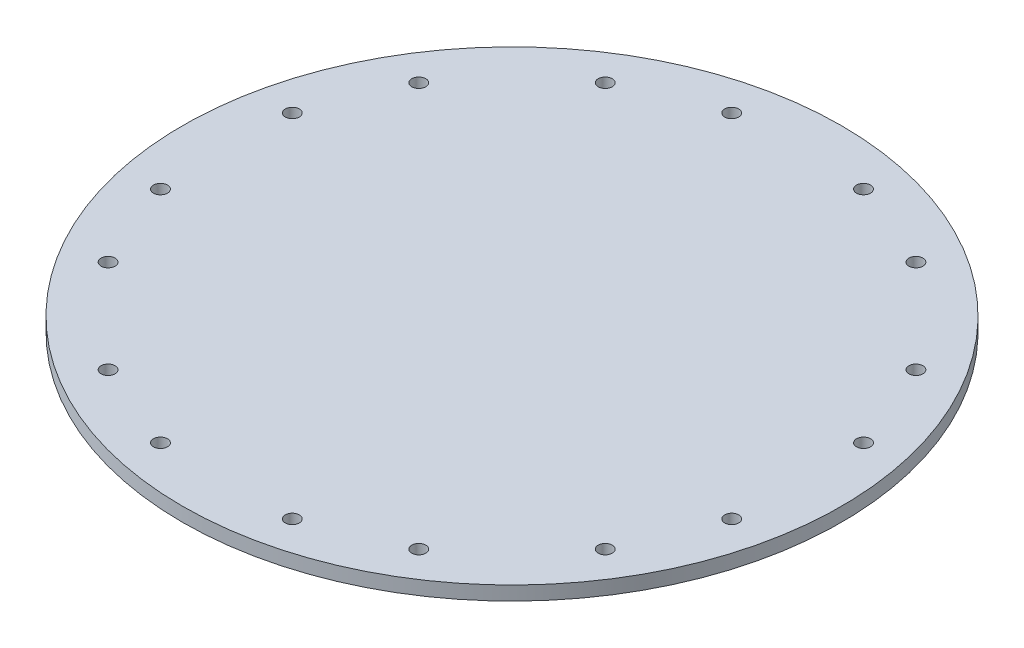
ISO-10303-21;
HEADER;
FILE_DESCRIPTION(('STEP AP214'),'2;1');
FILE_NAME('part.step','',(''),(''),'','','');
FILE_SCHEMA(('AUTOMOTIVE_DESIGN { 1 0 10303 214 1 1 1 1 }'));
ENDSEC;
DATA;
#1=APPLICATION_CONTEXT('core data for automotive mechanical design processes');
#2=APPLICATION_PROTOCOL_DEFINITION('international standard','automotive_design',2000,#1);
#3=PRODUCT_CONTEXT('',#1,'mechanical');
#4=PRODUCT('Part','Part','',(#3));
#5=PRODUCT_RELATED_PRODUCT_CATEGORY('part','',(#4));
#6=PRODUCT_DEFINITION_FORMATION('','',#4);
#7=PRODUCT_DEFINITION_CONTEXT('part definition',#1,'design');
#8=PRODUCT_DEFINITION('design','',#6,#7);
#9=PRODUCT_DEFINITION_SHAPE('','',#8);
#10=(LENGTH_UNIT() NAMED_UNIT(*) SI_UNIT(.MILLI.,.METRE.));
#11=(NAMED_UNIT(*) PLANE_ANGLE_UNIT() SI_UNIT($,.RADIAN.));
#12=(NAMED_UNIT(*) SI_UNIT($,.STERADIAN.) SOLID_ANGLE_UNIT());
#13=UNCERTAINTY_MEASURE_WITH_UNIT(LENGTH_MEASURE(1.E-05),#10,'distance_accuracy_value','');
#14=(GEOMETRIC_REPRESENTATION_CONTEXT(3) GLOBAL_UNCERTAINTY_ASSIGNED_CONTEXT((#13)) GLOBAL_UNIT_ASSIGNED_CONTEXT((#10,
#11,#12)) REPRESENTATION_CONTEXT('',''));
#15=CARTESIAN_POINT('',(0.,0.,0.));
#16=DIRECTION('',(0.,0.,1.));
#17=DIRECTION('',(1.,0.,0.));
#18=AXIS2_PLACEMENT_3D('',#15,#16,#17);
#19=CARTESIAN_POINT('',(0.,-6.35,0.));
#20=DIRECTION('',(0.,1.,0.));
#21=DIRECTION('',(0.,0.,1.));
#22=AXIS2_PLACEMENT_3D('',#19,#20,#21);
#23=CYLINDRICAL_SURFACE('',#22,150.);
#24=CARTESIAN_POINT('',(0.,-6.35,0.));
#25=DIRECTION('',(0.,1.,0.));
#26=DIRECTION('',(0.,0.,1.));
#27=AXIS2_PLACEMENT_3D('',#24,#25,#26);
#28=CIRCLE('',#27,150.);
#29=CARTESIAN_POINT('',(0.,-6.35,150.));
#30=VERTEX_POINT('',#29);
#31=EDGE_CURVE('E10',#30,#30,#28,.T.);
#32=ORIENTED_EDGE('',*,*,#31,.T.);
#33=EDGE_LOOP('',(#32));
#34=FACE_BOUND('',#33,.T.);
#35=CARTESIAN_POINT('',(0.,0.,0.));
#36=DIRECTION('',(0.,1.,0.));
#37=DIRECTION('',(0.,0.,1.));
#38=AXIS2_PLACEMENT_3D('',#35,#36,#37);
#39=CIRCLE('',#38,150.);
#40=CARTESIAN_POINT('',(0.,0.,150.));
#41=VERTEX_POINT('',#40);
#42=EDGE_CURVE('E42',#41,#41,#39,.T.);
#43=ORIENTED_EDGE('',*,*,#42,.F.);
#44=EDGE_LOOP('',(#43));
#45=FACE_BOUND('',#44,.T.);
#46=ADVANCED_FACE('F39',(#34,#45),#23,.T.);
#47=CARTESIAN_POINT('',(0.,-6.35,0.));
#48=DIRECTION('',(0.,1.,0.));
#49=DIRECTION('',(0.,0.,1.));
#50=AXIS2_PLACEMENT_3D('',#47,#48,#49);
#51=PLANE('',#50);
#52=CARTESIAN_POINT('',(70.7106781186534,-6.35,-113.137084989848));
#53=DIRECTION('',(0.,1.,0.));
#54=DIRECTION('',(0.,0.,1.));
#55=AXIS2_PLACEMENT_3D('',#52,#53,#54);
#56=CIRCLE('',#55,3.19999999999999);
#57=CARTESIAN_POINT('',(70.7106781186534,-6.35,-109.937084989848));
#58=VERTEX_POINT('',#57);
#59=EDGE_CURVE('E172',#58,#58,#56,.T.);
#60=ORIENTED_EDGE('',*,*,#59,.T.);
#61=EDGE_LOOP('',(#60));
#62=FACE_BOUND('',#61,.T.);
#63=CARTESIAN_POINT('',(113.137084989847,-6.35,-70.7106781186561));
#64=DIRECTION('',(0.,1.,0.));
#65=DIRECTION('',(0.,0.,1.));
#66=AXIS2_PLACEMENT_3D('',#63,#64,#65);
#67=CIRCLE('',#66,3.19999999999999);
#68=CARTESIAN_POINT('',(113.137084989847,-6.35,-67.5106781186561));
#69=VERTEX_POINT('',#68);
#70=EDGE_CURVE('E164',#69,#69,#67,.T.);
#71=ORIENTED_EDGE('',*,*,#70,.T.);
#72=EDGE_LOOP('',(#71));
#73=FACE_BOUND('',#72,.T.);
#74=CARTESIAN_POINT('',(130.,-6.35,-30.0000000000014));
#75=DIRECTION('',(0.,1.,0.));
#76=DIRECTION('',(0.,0.,1.));
#77=AXIS2_PLACEMENT_3D('',#74,#75,#76);
#78=CIRCLE('',#77,3.20000000000001);
#79=CARTESIAN_POINT('',(130.,-6.35,-26.8000000000014));
#80=VERTEX_POINT('',#79);
#81=EDGE_CURVE('E156',#80,#80,#78,.T.);
#82=ORIENTED_EDGE('',*,*,#81,.T.);
#83=EDGE_LOOP('',(#82));
#84=FACE_BOUND('',#83,.T.);
#85=CARTESIAN_POINT('',(130.,-6.35,29.9999999999986));
#86=DIRECTION('',(0.,1.,0.));
#87=DIRECTION('',(0.,0.,1.));
#88=AXIS2_PLACEMENT_3D('',#85,#86,#87);
#89=CIRCLE('',#88,3.20000000000001);
#90=CARTESIAN_POINT('',(130.,-6.35,33.1999999999986));
#91=VERTEX_POINT('',#90);
#92=EDGE_CURVE('E148',#91,#91,#89,.T.);
#93=ORIENTED_EDGE('',*,*,#92,.T.);
#94=EDGE_LOOP('',(#93));
#95=FACE_BOUND('',#94,.T.);
#96=CARTESIAN_POINT('',(113.137084989848,-6.35,70.7106781186538));
#97=DIRECTION('',(0.,1.,0.));
#98=DIRECTION('',(0.,0.,1.));
#99=AXIS2_PLACEMENT_3D('',#96,#97,#98);
#100=CIRCLE('',#99,3.19999999999999);
#101=CARTESIAN_POINT('',(113.137084989848,-6.35,73.9106781186538));
#102=VERTEX_POINT('',#101);
#103=EDGE_CURVE('E140',#102,#102,#100,.T.);
#104=ORIENTED_EDGE('',*,*,#103,.T.);
#105=EDGE_LOOP('',(#104));
#106=FACE_BOUND('',#105,.T.);
#107=CARTESIAN_POINT('',(70.7106781186557,-6.35,113.137084989847));
#108=DIRECTION('',(0.,1.,0.));
#109=DIRECTION('',(0.,0.,1.));
#110=AXIS2_PLACEMENT_3D('',#107,#108,#109);
#111=CIRCLE('',#110,3.19999999999999);
#112=CARTESIAN_POINT('',(70.7106781186557,-6.35,116.337084989847));
#113=VERTEX_POINT('',#112);
#114=EDGE_CURVE('E132',#113,#113,#111,.T.);
#115=ORIENTED_EDGE('',*,*,#114,.T.);
#116=EDGE_LOOP('',(#115));
#117=FACE_BOUND('',#116,.T.);
#118=CARTESIAN_POINT('',(30.,-6.35,130.));
#119=DIRECTION('',(0.,1.,0.));
#120=DIRECTION('',(0.,0.,1.));
#121=AXIS2_PLACEMENT_3D('',#118,#119,#120);
#122=CIRCLE('',#121,3.2);
#123=CARTESIAN_POINT('',(30.,-6.35,133.2));
#124=VERTEX_POINT('',#123);
#125=EDGE_CURVE('E124',#124,#124,#122,.T.);
#126=ORIENTED_EDGE('',*,*,#125,.T.);
#127=EDGE_LOOP('',(#126));
#128=FACE_BOUND('',#127,.T.);
#129=CARTESIAN_POINT('',(-30.,-6.35,130.));
#130=DIRECTION('',(0.,1.,0.));
#131=DIRECTION('',(0.,0.,1.));
#132=AXIS2_PLACEMENT_3D('',#129,#130,#131);
#133=CIRCLE('',#132,3.2);
#134=CARTESIAN_POINT('',(-30.,-6.35,133.2));
#135=VERTEX_POINT('',#134);
#136=EDGE_CURVE('E116',#135,#135,#133,.T.);
#137=ORIENTED_EDGE('',*,*,#136,.T.);
#138=EDGE_LOOP('',(#137));
#139=FACE_BOUND('',#138,.T.);
#140=CARTESIAN_POINT('',(-70.7106781186542,-6.35,113.137084989848));
#141=DIRECTION('',(0.,1.,0.));
#142=DIRECTION('',(0.,0.,1.));
#143=AXIS2_PLACEMENT_3D('',#140,#141,#142);
#144=CIRCLE('',#143,3.19999999999999);
#145=CARTESIAN_POINT('',(-70.7106781186542,-6.35,116.337084989848));
#146=VERTEX_POINT('',#145);
#147=EDGE_CURVE('E108',#146,#146,#144,.T.);
#148=ORIENTED_EDGE('',*,*,#147,.T.);
#149=EDGE_LOOP('',(#148));
#150=FACE_BOUND('',#149,.T.);
#151=CARTESIAN_POINT('',(-113.137084989847,-6.35,70.7106781186554));
#152=DIRECTION('',(0.,1.,0.));
#153=DIRECTION('',(0.,0.,1.));
#154=AXIS2_PLACEMENT_3D('',#151,#152,#153);
#155=CIRCLE('',#154,3.19999999999999);
#156=CARTESIAN_POINT('',(-113.137084989847,-6.35,73.9106781186553));
#157=VERTEX_POINT('',#156);
#158=EDGE_CURVE('E100',#157,#157,#155,.T.);
#159=ORIENTED_EDGE('',*,*,#158,.T.);
#160=EDGE_LOOP('',(#159));
#161=FACE_BOUND('',#160,.T.);
#162=CARTESIAN_POINT('',(-130.,-6.35,30.0000000000005));
#163=DIRECTION('',(0.,1.,0.));
#164=DIRECTION('',(0.,0.,1.));
#165=AXIS2_PLACEMENT_3D('',#162,#163,#164);
#166=CIRCLE('',#165,3.20000000000001);
#167=CARTESIAN_POINT('',(-130.,-6.35,33.2000000000005));
#168=VERTEX_POINT('',#167);
#169=EDGE_CURVE('E92',#168,#168,#166,.T.);
#170=ORIENTED_EDGE('',*,*,#169,.T.);
#171=EDGE_LOOP('',(#170));
#172=FACE_BOUND('',#171,.T.);
#173=CARTESIAN_POINT('',(-130.,-6.35,-29.9999999999995));
#174=DIRECTION('',(0.,1.,0.));
#175=DIRECTION('',(0.,0.,1.));
#176=AXIS2_PLACEMENT_3D('',#173,#174,#175);
#177=CIRCLE('',#176,3.20000000000001);
#178=CARTESIAN_POINT('',(-130.,-6.35,-26.7999999999995));
#179=VERTEX_POINT('',#178);
#180=EDGE_CURVE('E84',#179,#179,#177,.T.);
#181=ORIENTED_EDGE('',*,*,#180,.T.);
#182=EDGE_LOOP('',(#181));
#183=FACE_BOUND('',#182,.T.);
#184=CARTESIAN_POINT('',(-113.137084989848,-6.35,-70.7106781186546));
#185=DIRECTION('',(0.,1.,0.));
#186=DIRECTION('',(0.,0.,1.));
#187=AXIS2_PLACEMENT_3D('',#184,#185,#186);
#188=CIRCLE('',#187,3.19999999999999);
#189=CARTESIAN_POINT('',(-113.137084989848,-6.35,-67.5106781186546));
#190=VERTEX_POINT('',#189);
#191=EDGE_CURVE('E76',#190,#190,#188,.T.);
#192=ORIENTED_EDGE('',*,*,#191,.T.);
#193=EDGE_LOOP('',(#192));
#194=FACE_BOUND('',#193,.T.);
#195=CARTESIAN_POINT('',(-70.710678118655,-6.35,-113.137084989847));
#196=DIRECTION('',(0.,1.,0.));
#197=DIRECTION('',(0.,0.,1.));
#198=AXIS2_PLACEMENT_3D('',#195,#196,#197);
#199=CIRCLE('',#198,3.19999999999999);
#200=CARTESIAN_POINT('',(-70.710678118655,-6.35,-109.937084989848));
#201=VERTEX_POINT('',#200);
#202=EDGE_CURVE('E68',#201,#201,#199,.T.);
#203=ORIENTED_EDGE('',*,*,#202,.T.);
#204=EDGE_LOOP('',(#203));
#205=FACE_BOUND('',#204,.T.);
#206=CARTESIAN_POINT('',(-30.,-6.35,-130.));
#207=DIRECTION('',(0.,1.,0.));
#208=DIRECTION('',(0.,0.,1.));
#209=AXIS2_PLACEMENT_3D('',#206,#207,#208);
#210=CIRCLE('',#209,3.2);
#211=CARTESIAN_POINT('',(-30.,-6.35,-126.8));
#212=VERTEX_POINT('',#211);
#213=EDGE_CURVE('E60',#212,#212,#210,.T.);
#214=ORIENTED_EDGE('',*,*,#213,.T.);
#215=EDGE_LOOP('',(#214));
#216=FACE_BOUND('',#215,.T.);
#217=CARTESIAN_POINT('',(30.,-6.35,-130.));
#218=DIRECTION('',(0.,1.,0.));
#219=DIRECTION('',(0.,0.,1.));
#220=AXIS2_PLACEMENT_3D('',#217,#218,#219);
#221=CIRCLE('',#220,3.2);
#222=CARTESIAN_POINT('',(30.,-6.35,-126.8));
#223=VERTEX_POINT('',#222);
#224=EDGE_CURVE('E51',#223,#223,#221,.T.);
#225=ORIENTED_EDGE('',*,*,#224,.T.);
#226=EDGE_LOOP('',(#225));
#227=FACE_BOUND('',#226,.T.);
#228=ORIENTED_EDGE('',*,*,#31,.F.);
#229=EDGE_LOOP('',(#228));
#230=FACE_BOUND('',#229,.T.);
#231=ADVANCED_FACE('F187',(#62,#73,#84,#95,#106,#117,#128,#139,#150,#161,#172,#183,#194,#205,
#216,#227,#230),#51,.F.);
#232=CARTESIAN_POINT('',(0.,0.,0.));
#233=DIRECTION('',(0.,1.,0.));
#234=DIRECTION('',(0.,0.,1.));
#235=AXIS2_PLACEMENT_3D('',#232,#233,#234);
#236=PLANE('',#235);
#237=CARTESIAN_POINT('',(70.7106781186534,0.,-113.137084989848));
#238=DIRECTION('',(0.,1.,0.));
#239=DIRECTION('',(0.,0.,1.));
#240=AXIS2_PLACEMENT_3D('',#237,#238,#239);
#241=CIRCLE('',#240,3.19999999999999);
#242=CARTESIAN_POINT('',(70.7106781186534,0.,-109.937084989848));
#243=VERTEX_POINT('',#242);
#244=EDGE_CURVE('E176',#243,#243,#241,.T.);
#245=ORIENTED_EDGE('',*,*,#244,.F.);
#246=EDGE_LOOP('',(#245));
#247=FACE_BOUND('',#246,.T.);
#248=CARTESIAN_POINT('',(113.137084989847,0.,-70.7106781186561));
#249=DIRECTION('',(0.,1.,0.));
#250=DIRECTION('',(0.,0.,1.));
#251=AXIS2_PLACEMENT_3D('',#248,#249,#250);
#252=CIRCLE('',#251,3.19999999999999);
#253=CARTESIAN_POINT('',(113.137084989847,0.,-67.5106781186561));
#254=VERTEX_POINT('',#253);
#255=EDGE_CURVE('E168',#254,#254,#252,.T.);
#256=ORIENTED_EDGE('',*,*,#255,.F.);
#257=EDGE_LOOP('',(#256));
#258=FACE_BOUND('',#257,.T.);
#259=CARTESIAN_POINT('',(130.,0.,-30.0000000000014));
#260=DIRECTION('',(0.,1.,0.));
#261=DIRECTION('',(0.,0.,1.));
#262=AXIS2_PLACEMENT_3D('',#259,#260,#261);
#263=CIRCLE('',#262,3.20000000000001);
#264=CARTESIAN_POINT('',(130.,0.,-26.8000000000014));
#265=VERTEX_POINT('',#264);
#266=EDGE_CURVE('E160',#265,#265,#263,.T.);
#267=ORIENTED_EDGE('',*,*,#266,.F.);
#268=EDGE_LOOP('',(#267));
#269=FACE_BOUND('',#268,.T.);
#270=CARTESIAN_POINT('',(130.,0.,29.9999999999986));
#271=DIRECTION('',(0.,1.,0.));
#272=DIRECTION('',(0.,0.,1.));
#273=AXIS2_PLACEMENT_3D('',#270,#271,#272);
#274=CIRCLE('',#273,3.20000000000001);
#275=CARTESIAN_POINT('',(130.,0.,33.1999999999986));
#276=VERTEX_POINT('',#275);
#277=EDGE_CURVE('E152',#276,#276,#274,.T.);
#278=ORIENTED_EDGE('',*,*,#277,.F.);
#279=EDGE_LOOP('',(#278));
#280=FACE_BOUND('',#279,.T.);
#281=CARTESIAN_POINT('',(113.137084989848,0.,70.7106781186538));
#282=DIRECTION('',(0.,1.,0.));
#283=DIRECTION('',(0.,0.,1.));
#284=AXIS2_PLACEMENT_3D('',#281,#282,#283);
#285=CIRCLE('',#284,3.19999999999999);
#286=CARTESIAN_POINT('',(113.137084989848,0.,73.9106781186538));
#287=VERTEX_POINT('',#286);
#288=EDGE_CURVE('E144',#287,#287,#285,.T.);
#289=ORIENTED_EDGE('',*,*,#288,.F.);
#290=EDGE_LOOP('',(#289));
#291=FACE_BOUND('',#290,.T.);
#292=CARTESIAN_POINT('',(70.7106781186557,0.,113.137084989847));
#293=DIRECTION('',(0.,1.,0.));
#294=DIRECTION('',(0.,0.,1.));
#295=AXIS2_PLACEMENT_3D('',#292,#293,#294);
#296=CIRCLE('',#295,3.19999999999999);
#297=CARTESIAN_POINT('',(70.7106781186557,0.,116.337084989847));
#298=VERTEX_POINT('',#297);
#299=EDGE_CURVE('E136',#298,#298,#296,.T.);
#300=ORIENTED_EDGE('',*,*,#299,.F.);
#301=EDGE_LOOP('',(#300));
#302=FACE_BOUND('',#301,.T.);
#303=CARTESIAN_POINT('',(30.,0.,130.));
#304=DIRECTION('',(0.,1.,0.));
#305=DIRECTION('',(0.,0.,1.));
#306=AXIS2_PLACEMENT_3D('',#303,#304,#305);
#307=CIRCLE('',#306,3.2);
#308=CARTESIAN_POINT('',(30.,0.,133.2));
#309=VERTEX_POINT('',#308);
#310=EDGE_CURVE('E128',#309,#309,#307,.T.);
#311=ORIENTED_EDGE('',*,*,#310,.F.);
#312=EDGE_LOOP('',(#311));
#313=FACE_BOUND('',#312,.T.);
#314=CARTESIAN_POINT('',(-30.,0.,130.));
#315=DIRECTION('',(0.,1.,0.));
#316=DIRECTION('',(0.,0.,1.));
#317=AXIS2_PLACEMENT_3D('',#314,#315,#316);
#318=CIRCLE('',#317,3.2);
#319=CARTESIAN_POINT('',(-30.,0.,133.2));
#320=VERTEX_POINT('',#319);
#321=EDGE_CURVE('E120',#320,#320,#318,.T.);
#322=ORIENTED_EDGE('',*,*,#321,.F.);
#323=EDGE_LOOP('',(#322));
#324=FACE_BOUND('',#323,.T.);
#325=CARTESIAN_POINT('',(-70.7106781186542,0.,113.137084989848));
#326=DIRECTION('',(0.,1.,0.));
#327=DIRECTION('',(0.,0.,1.));
#328=AXIS2_PLACEMENT_3D('',#325,#326,#327);
#329=CIRCLE('',#328,3.19999999999999);
#330=CARTESIAN_POINT('',(-70.7106781186542,0.,116.337084989848));
#331=VERTEX_POINT('',#330);
#332=EDGE_CURVE('E112',#331,#331,#329,.T.);
#333=ORIENTED_EDGE('',*,*,#332,.F.);
#334=EDGE_LOOP('',(#333));
#335=FACE_BOUND('',#334,.T.);
#336=CARTESIAN_POINT('',(-113.137084989847,0.,70.7106781186554));
#337=DIRECTION('',(0.,1.,0.));
#338=DIRECTION('',(0.,0.,1.));
#339=AXIS2_PLACEMENT_3D('',#336,#337,#338);
#340=CIRCLE('',#339,3.19999999999999);
#341=CARTESIAN_POINT('',(-113.137084989847,0.,73.9106781186553));
#342=VERTEX_POINT('',#341);
#343=EDGE_CURVE('E104',#342,#342,#340,.T.);
#344=ORIENTED_EDGE('',*,*,#343,.F.);
#345=EDGE_LOOP('',(#344));
#346=FACE_BOUND('',#345,.T.);
#347=CARTESIAN_POINT('',(-130.,0.,30.0000000000005));
#348=DIRECTION('',(0.,1.,0.));
#349=DIRECTION('',(0.,0.,1.));
#350=AXIS2_PLACEMENT_3D('',#347,#348,#349);
#351=CIRCLE('',#350,3.20000000000001);
#352=CARTESIAN_POINT('',(-130.,0.,33.2000000000005));
#353=VERTEX_POINT('',#352);
#354=EDGE_CURVE('E96',#353,#353,#351,.T.);
#355=ORIENTED_EDGE('',*,*,#354,.F.);
#356=EDGE_LOOP('',(#355));
#357=FACE_BOUND('',#356,.T.);
#358=CARTESIAN_POINT('',(-130.,0.,-29.9999999999995));
#359=DIRECTION('',(0.,1.,0.));
#360=DIRECTION('',(0.,0.,1.));
#361=AXIS2_PLACEMENT_3D('',#358,#359,#360);
#362=CIRCLE('',#361,3.20000000000001);
#363=CARTESIAN_POINT('',(-130.,0.,-26.7999999999995));
#364=VERTEX_POINT('',#363);
#365=EDGE_CURVE('E88',#364,#364,#362,.T.);
#366=ORIENTED_EDGE('',*,*,#365,.F.);
#367=EDGE_LOOP('',(#366));
#368=FACE_BOUND('',#367,.T.);
#369=CARTESIAN_POINT('',(-113.137084989848,0.,-70.7106781186546));
#370=DIRECTION('',(0.,1.,0.));
#371=DIRECTION('',(0.,0.,1.));
#372=AXIS2_PLACEMENT_3D('',#369,#370,#371);
#373=CIRCLE('',#372,3.19999999999999);
#374=CARTESIAN_POINT('',(-113.137084989848,0.,-67.5106781186546));
#375=VERTEX_POINT('',#374);
#376=EDGE_CURVE('E80',#375,#375,#373,.T.);
#377=ORIENTED_EDGE('',*,*,#376,.F.);
#378=EDGE_LOOP('',(#377));
#379=FACE_BOUND('',#378,.T.);
#380=CARTESIAN_POINT('',(-70.710678118655,0.,-113.137084989847));
#381=DIRECTION('',(0.,1.,0.));
#382=DIRECTION('',(0.,0.,1.));
#383=AXIS2_PLACEMENT_3D('',#380,#381,#382);
#384=CIRCLE('',#383,3.19999999999999);
#385=CARTESIAN_POINT('',(-70.710678118655,0.,-109.937084989848));
#386=VERTEX_POINT('',#385);
#387=EDGE_CURVE('E72',#386,#386,#384,.T.);
#388=ORIENTED_EDGE('',*,*,#387,.F.);
#389=EDGE_LOOP('',(#388));
#390=FACE_BOUND('',#389,.T.);
#391=CARTESIAN_POINT('',(-30.,0.,-130.));
#392=DIRECTION('',(0.,1.,0.));
#393=DIRECTION('',(0.,0.,1.));
#394=AXIS2_PLACEMENT_3D('',#391,#392,#393);
#395=CIRCLE('',#394,3.2);
#396=CARTESIAN_POINT('',(-30.,0.,-126.8));
#397=VERTEX_POINT('',#396);
#398=EDGE_CURVE('E64',#397,#397,#395,.T.);
#399=ORIENTED_EDGE('',*,*,#398,.F.);
#400=EDGE_LOOP('',(#399));
#401=FACE_BOUND('',#400,.T.);
#402=CARTESIAN_POINT('',(30.,0.,-130.));
#403=DIRECTION('',(0.,1.,0.));
#404=DIRECTION('',(0.,0.,1.));
#405=AXIS2_PLACEMENT_3D('',#402,#403,#404);
#406=CIRCLE('',#405,3.2);
#407=CARTESIAN_POINT('',(30.,0.,-126.8));
#408=VERTEX_POINT('',#407);
#409=EDGE_CURVE('E56',#408,#408,#406,.T.);
#410=ORIENTED_EDGE('',*,*,#409,.F.);
#411=EDGE_LOOP('',(#410));
#412=FACE_BOUND('',#411,.T.);
#413=ORIENTED_EDGE('',*,*,#42,.T.);
#414=EDGE_LOOP('',(#413));
#415=FACE_BOUND('',#414,.T.);
#416=ADVANCED_FACE('F183',(#247,#258,#269,#280,#291,#302,#313,#324,#335,#346,#357,#368,#379,
#390,#401,#412,#415),#236,.T.);
#417=CARTESIAN_POINT('',(30.,0.,-130.));
#418=DIRECTION('',(0.,1.,0.));
#419=DIRECTION('',(0.,0.,1.));
#420=AXIS2_PLACEMENT_3D('',#417,#418,#419);
#421=CYLINDRICAL_SURFACE('',#420,3.2);
#422=ORIENTED_EDGE('',*,*,#224,.F.);
#423=EDGE_LOOP('',(#422));
#424=FACE_BOUND('',#423,.T.);
#425=ORIENTED_EDGE('',*,*,#409,.T.);
#426=EDGE_LOOP('',(#425));
#427=FACE_BOUND('',#426,.T.);
#428=ADVANCED_FACE('F186',(#424,#427),#421,.F.);
#429=CARTESIAN_POINT('',(-30.,0.,-130.));
#430=DIRECTION('',(0.,1.,0.));
#431=DIRECTION('',(0.,0.,1.));
#432=AXIS2_PLACEMENT_3D('',#429,#430,#431);
#433=CYLINDRICAL_SURFACE('',#432,3.2);
#434=ORIENTED_EDGE('',*,*,#213,.F.);
#435=EDGE_LOOP('',(#434));
#436=FACE_BOUND('',#435,.T.);
#437=ORIENTED_EDGE('',*,*,#398,.T.);
#438=EDGE_LOOP('',(#437));
#439=FACE_BOUND('',#438,.T.);
#440=ADVANCED_FACE('F232',(#436,#439),#433,.F.);
#441=CARTESIAN_POINT('',(-70.710678118655,0.,-113.137084989847));
#442=DIRECTION('',(0.,1.,0.));
#443=DIRECTION('',(0.,0.,1.));
#444=AXIS2_PLACEMENT_3D('',#441,#442,#443);
#445=CYLINDRICAL_SURFACE('',#444,3.19999999999999);
#446=ORIENTED_EDGE('',*,*,#202,.F.);
#447=EDGE_LOOP('',(#446));
#448=FACE_BOUND('',#447,.T.);
#449=ORIENTED_EDGE('',*,*,#387,.T.);
#450=EDGE_LOOP('',(#449));
#451=FACE_BOUND('',#450,.T.);
#452=ADVANCED_FACE('F236',(#448,#451),#445,.F.);
#453=CARTESIAN_POINT('',(-113.137084989848,0.,-70.7106781186546));
#454=DIRECTION('',(0.,1.,0.));
#455=DIRECTION('',(0.,0.,1.));
#456=AXIS2_PLACEMENT_3D('',#453,#454,#455);
#457=CYLINDRICAL_SURFACE('',#456,3.19999999999999);
#458=ORIENTED_EDGE('',*,*,#191,.F.);
#459=EDGE_LOOP('',(#458));
#460=FACE_BOUND('',#459,.T.);
#461=ORIENTED_EDGE('',*,*,#376,.T.);
#462=EDGE_LOOP('',(#461));
#463=FACE_BOUND('',#462,.T.);
#464=ADVANCED_FACE('F240',(#460,#463),#457,.F.);
#465=CARTESIAN_POINT('',(-130.,0.,-29.9999999999995));
#466=DIRECTION('',(0.,1.,0.));
#467=DIRECTION('',(0.,0.,1.));
#468=AXIS2_PLACEMENT_3D('',#465,#466,#467);
#469=CYLINDRICAL_SURFACE('',#468,3.20000000000001);
#470=ORIENTED_EDGE('',*,*,#180,.F.);
#471=EDGE_LOOP('',(#470));
#472=FACE_BOUND('',#471,.T.);
#473=ORIENTED_EDGE('',*,*,#365,.T.);
#474=EDGE_LOOP('',(#473));
#475=FACE_BOUND('',#474,.T.);
#476=ADVANCED_FACE('F244',(#472,#475),#469,.F.);
#477=CARTESIAN_POINT('',(-130.,0.,30.0000000000005));
#478=DIRECTION('',(0.,1.,0.));
#479=DIRECTION('',(0.,0.,1.));
#480=AXIS2_PLACEMENT_3D('',#477,#478,#479);
#481=CYLINDRICAL_SURFACE('',#480,3.20000000000001);
#482=ORIENTED_EDGE('',*,*,#169,.F.);
#483=EDGE_LOOP('',(#482));
#484=FACE_BOUND('',#483,.T.);
#485=ORIENTED_EDGE('',*,*,#354,.T.);
#486=EDGE_LOOP('',(#485));
#487=FACE_BOUND('',#486,.T.);
#488=ADVANCED_FACE('F248',(#484,#487),#481,.F.);
#489=CARTESIAN_POINT('',(-113.137084989847,0.,70.7106781186554));
#490=DIRECTION('',(0.,1.,0.));
#491=DIRECTION('',(0.,0.,1.));
#492=AXIS2_PLACEMENT_3D('',#489,#490,#491);
#493=CYLINDRICAL_SURFACE('',#492,3.19999999999999);
#494=ORIENTED_EDGE('',*,*,#158,.F.);
#495=EDGE_LOOP('',(#494));
#496=FACE_BOUND('',#495,.T.);
#497=ORIENTED_EDGE('',*,*,#343,.T.);
#498=EDGE_LOOP('',(#497));
#499=FACE_BOUND('',#498,.T.);
#500=ADVANCED_FACE('F252',(#496,#499),#493,.F.);
#501=CARTESIAN_POINT('',(-70.7106781186542,0.,113.137084989848));
#502=DIRECTION('',(0.,1.,0.));
#503=DIRECTION('',(0.,0.,1.));
#504=AXIS2_PLACEMENT_3D('',#501,#502,#503);
#505=CYLINDRICAL_SURFACE('',#504,3.19999999999999);
#506=ORIENTED_EDGE('',*,*,#147,.F.);
#507=EDGE_LOOP('',(#506));
#508=FACE_BOUND('',#507,.T.);
#509=ORIENTED_EDGE('',*,*,#332,.T.);
#510=EDGE_LOOP('',(#509));
#511=FACE_BOUND('',#510,.T.);
#512=ADVANCED_FACE('F256',(#508,#511),#505,.F.);
#513=CARTESIAN_POINT('',(-30.,0.,130.));
#514=DIRECTION('',(0.,1.,0.));
#515=DIRECTION('',(0.,0.,1.));
#516=AXIS2_PLACEMENT_3D('',#513,#514,#515);
#517=CYLINDRICAL_SURFACE('',#516,3.2);
#518=ORIENTED_EDGE('',*,*,#136,.F.);
#519=EDGE_LOOP('',(#518));
#520=FACE_BOUND('',#519,.T.);
#521=ORIENTED_EDGE('',*,*,#321,.T.);
#522=EDGE_LOOP('',(#521));
#523=FACE_BOUND('',#522,.T.);
#524=ADVANCED_FACE('F260',(#520,#523),#517,.F.);
#525=CARTESIAN_POINT('',(30.,0.,130.));
#526=DIRECTION('',(0.,1.,0.));
#527=DIRECTION('',(0.,0.,1.));
#528=AXIS2_PLACEMENT_3D('',#525,#526,#527);
#529=CYLINDRICAL_SURFACE('',#528,3.2);
#530=ORIENTED_EDGE('',*,*,#125,.F.);
#531=EDGE_LOOP('',(#530));
#532=FACE_BOUND('',#531,.T.);
#533=ORIENTED_EDGE('',*,*,#310,.T.);
#534=EDGE_LOOP('',(#533));
#535=FACE_BOUND('',#534,.T.);
#536=ADVANCED_FACE('F264',(#532,#535),#529,.F.);
#537=CARTESIAN_POINT('',(70.7106781186557,0.,113.137084989847));
#538=DIRECTION('',(0.,1.,0.));
#539=DIRECTION('',(0.,0.,1.));
#540=AXIS2_PLACEMENT_3D('',#537,#538,#539);
#541=CYLINDRICAL_SURFACE('',#540,3.19999999999999);
#542=ORIENTED_EDGE('',*,*,#114,.F.);
#543=EDGE_LOOP('',(#542));
#544=FACE_BOUND('',#543,.T.);
#545=ORIENTED_EDGE('',*,*,#299,.T.);
#546=EDGE_LOOP('',(#545));
#547=FACE_BOUND('',#546,.T.);
#548=ADVANCED_FACE('F268',(#544,#547),#541,.F.);
#549=CARTESIAN_POINT('',(113.137084989848,0.,70.7106781186538));
#550=DIRECTION('',(0.,1.,0.));
#551=DIRECTION('',(0.,0.,1.));
#552=AXIS2_PLACEMENT_3D('',#549,#550,#551);
#553=CYLINDRICAL_SURFACE('',#552,3.19999999999999);
#554=ORIENTED_EDGE('',*,*,#103,.F.);
#555=EDGE_LOOP('',(#554));
#556=FACE_BOUND('',#555,.T.);
#557=ORIENTED_EDGE('',*,*,#288,.T.);
#558=EDGE_LOOP('',(#557));
#559=FACE_BOUND('',#558,.T.);
#560=ADVANCED_FACE('F272',(#556,#559),#553,.F.);
#561=CARTESIAN_POINT('',(130.,0.,29.9999999999986));
#562=DIRECTION('',(0.,1.,0.));
#563=DIRECTION('',(0.,0.,1.));
#564=AXIS2_PLACEMENT_3D('',#561,#562,#563);
#565=CYLINDRICAL_SURFACE('',#564,3.20000000000001);
#566=ORIENTED_EDGE('',*,*,#92,.F.);
#567=EDGE_LOOP('',(#566));
#568=FACE_BOUND('',#567,.T.);
#569=ORIENTED_EDGE('',*,*,#277,.T.);
#570=EDGE_LOOP('',(#569));
#571=FACE_BOUND('',#570,.T.);
#572=ADVANCED_FACE('F276',(#568,#571),#565,.F.);
#573=CARTESIAN_POINT('',(130.,0.,-30.0000000000014));
#574=DIRECTION('',(0.,1.,0.));
#575=DIRECTION('',(0.,0.,1.));
#576=AXIS2_PLACEMENT_3D('',#573,#574,#575);
#577=CYLINDRICAL_SURFACE('',#576,3.20000000000001);
#578=ORIENTED_EDGE('',*,*,#81,.F.);
#579=EDGE_LOOP('',(#578));
#580=FACE_BOUND('',#579,.T.);
#581=ORIENTED_EDGE('',*,*,#266,.T.);
#582=EDGE_LOOP('',(#581));
#583=FACE_BOUND('',#582,.T.);
#584=ADVANCED_FACE('F280',(#580,#583),#577,.F.);
#585=CARTESIAN_POINT('',(113.137084989847,0.,-70.7106781186561));
#586=DIRECTION('',(0.,1.,0.));
#587=DIRECTION('',(0.,0.,1.));
#588=AXIS2_PLACEMENT_3D('',#585,#586,#587);
#589=CYLINDRICAL_SURFACE('',#588,3.19999999999999);
#590=ORIENTED_EDGE('',*,*,#70,.F.);
#591=EDGE_LOOP('',(#590));
#592=FACE_BOUND('',#591,.T.);
#593=ORIENTED_EDGE('',*,*,#255,.T.);
#594=EDGE_LOOP('',(#593));
#595=FACE_BOUND('',#594,.T.);
#596=ADVANCED_FACE('F284',(#592,#595),#589,.F.);
#597=CARTESIAN_POINT('',(70.7106781186534,0.,-113.137084989848));
#598=DIRECTION('',(0.,1.,0.));
#599=DIRECTION('',(0.,0.,1.));
#600=AXIS2_PLACEMENT_3D('',#597,#598,#599);
#601=CYLINDRICAL_SURFACE('',#600,3.19999999999999);
#602=ORIENTED_EDGE('',*,*,#59,.F.);
#603=EDGE_LOOP('',(#602));
#604=FACE_BOUND('',#603,.T.);
#605=ORIENTED_EDGE('',*,*,#244,.T.);
#606=EDGE_LOOP('',(#605));
#607=FACE_BOUND('',#606,.T.);
#608=ADVANCED_FACE('F181',(#604,#607),#601,.F.);
#609=CLOSED_SHELL('',(#46,#231,#416,#428,#440,#452,#464,#476,#488,#500,#512,#524,#536,#548,#560,
#572,#584,#596,#608));
#610=MANIFOLD_SOLID_BREP('B2',#609);
#611=ADVANCED_BREP_SHAPE_REPRESENTATION('',(#18,#610),#14);
#612=SHAPE_DEFINITION_REPRESENTATION(#9,#611);
ENDSEC;
END-ISO-10303-21;
